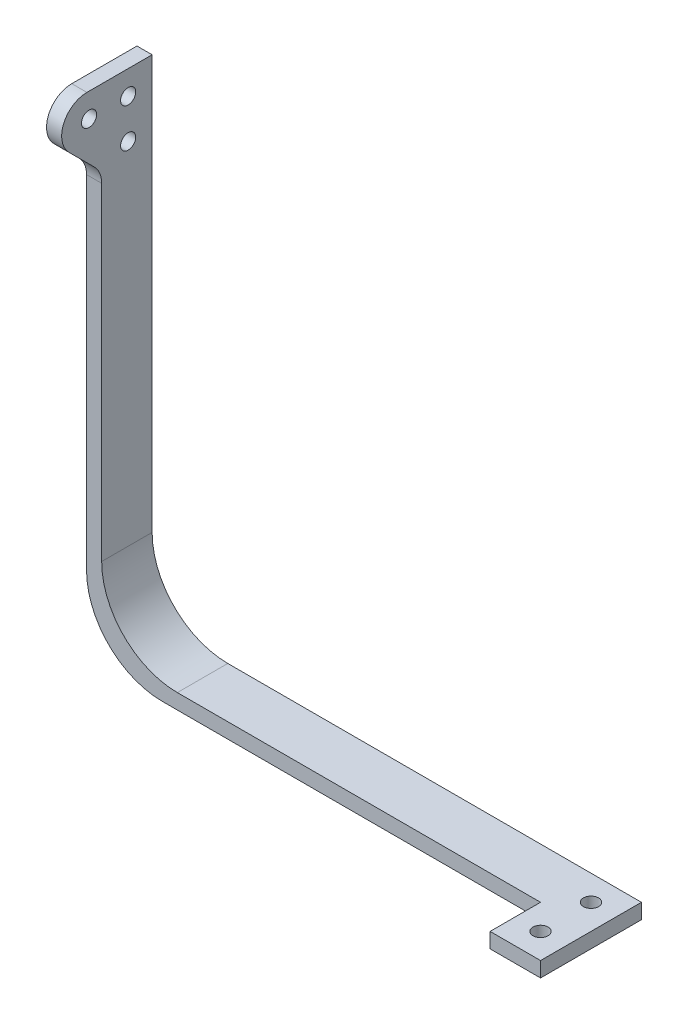
ISO-10303-21;
HEADER;
FILE_DESCRIPTION(('STEP AP214'),'2;1');
FILE_NAME('part.step','',(''),(''),'','','');
FILE_SCHEMA(('AUTOMOTIVE_DESIGN { 1 0 10303 214 1 1 1 1 }'));
ENDSEC;
DATA;
#1=APPLICATION_CONTEXT('core data for automotive mechanical design processes');
#2=APPLICATION_PROTOCOL_DEFINITION('international standard','automotive_design',2000,#1);
#3=PRODUCT_CONTEXT('',#1,'mechanical');
#4=PRODUCT('Part','Part','',(#3));
#5=PRODUCT_RELATED_PRODUCT_CATEGORY('part','',(#4));
#6=PRODUCT_DEFINITION_FORMATION('','',#4);
#7=PRODUCT_DEFINITION_CONTEXT('part definition',#1,'design');
#8=PRODUCT_DEFINITION('design','',#6,#7);
#9=PRODUCT_DEFINITION_SHAPE('','',#8);
#10=(LENGTH_UNIT() NAMED_UNIT(*) SI_UNIT(.MILLI.,.METRE.));
#11=(NAMED_UNIT(*) PLANE_ANGLE_UNIT() SI_UNIT($,.RADIAN.));
#12=(NAMED_UNIT(*) SI_UNIT($,.STERADIAN.) SOLID_ANGLE_UNIT());
#13=UNCERTAINTY_MEASURE_WITH_UNIT(LENGTH_MEASURE(1.E-05),#10,'distance_accuracy_value','');
#14=(GEOMETRIC_REPRESENTATION_CONTEXT(3) GLOBAL_UNCERTAINTY_ASSIGNED_CONTEXT((#13)) GLOBAL_UNIT_ASSIGNED_CONTEXT((#10,
#11,#12)) REPRESENTATION_CONTEXT('',''));
#15=CARTESIAN_POINT('',(0.,0.,0.));
#16=DIRECTION('',(0.,0.,1.));
#17=DIRECTION('',(1.,0.,0.));
#18=AXIS2_PLACEMENT_3D('',#15,#16,#17);
#19=CARTESIAN_POINT('',(0.,0.,10.));
#20=DIRECTION('',(1.,0.,0.));
#21=DIRECTION('',(0.,0.,-1.));
#22=AXIS2_PLACEMENT_3D('',#19,#20,#21);
#23=PLANE('',#22);
#24=DIRECTION('',(0.,-0.707106781186547,-0.707106781186548));
#25=VECTOR('',#24,1.);
#26=CARTESIAN_POINT('',(0.,75.,0.));
#27=LINE('',#26,#25);
#28=CARTESIAN_POINT('',(0.,91.4644660940673,16.4644660940673));
#29=VERTEX_POINT('',#28);
#30=CARTESIAN_POINT('',(0.,86.4644660940673,11.4644660940673));
#31=VERTEX_POINT('',#30);
#32=EDGE_CURVE('E149',#29,#31,#27,.T.);
#33=ORIENTED_EDGE('',*,*,#32,.F.);
#34=CARTESIAN_POINT('',(0.,95.,12.9289321881345));
#35=DIRECTION('',(1.,0.,0.));
#36=DIRECTION('',(0.,0.,-1.));
#37=AXIS2_PLACEMENT_3D('',#34,#35,#36);
#38=CIRCLE('',#37,5.);
#39=CARTESIAN_POINT('',(0.,100.,12.9289321881345));
#40=VERTEX_POINT('',#39);
#41=EDGE_CURVE('E48',#29,#40,#38,.F.);
#42=ORIENTED_EDGE('',*,*,#41,.T.);
#43=DIRECTION('',(0.,0.,1.));
#44=VECTOR('',#43,1.);
#45=CARTESIAN_POINT('',(0.,100.,0.));
#46=LINE('',#45,#44);
#47=CARTESIAN_POINT('',(0.,100.,0.));
#48=VERTEX_POINT('',#47);
#49=EDGE_CURVE('E145',#48,#40,#46,.T.);
#50=ORIENTED_EDGE('',*,*,#49,.F.);
#51=DIRECTION('',(0.,-1.,0.));
#52=VECTOR('',#51,1.);
#53=CARTESIAN_POINT('',(0.,0.,0.));
#54=LINE('',#53,#52);
#55=CARTESIAN_POINT('',(0.,15.,0.));
#56=VERTEX_POINT('',#55);
#57=EDGE_CURVE('E130',#48,#56,#54,.T.);
#58=ORIENTED_EDGE('',*,*,#57,.T.);
#59=DIRECTION('',(0.,0.,-1.));
#60=VECTOR('',#59,1.);
#61=CARTESIAN_POINT('',(0.,15.,10.));
#62=LINE('',#61,#60);
#63=CARTESIAN_POINT('',(0.,15.,10.));
#64=VERTEX_POINT('',#63);
#65=EDGE_CURVE('E220',#56,#64,#62,.F.);
#66=ORIENTED_EDGE('',*,*,#65,.T.);
#67=DIRECTION('',(0.,-1.,0.));
#68=VECTOR('',#67,1.);
#69=CARTESIAN_POINT('',(0.,0.,10.));
#70=LINE('',#69,#68);
#71=CARTESIAN_POINT('',(0.,82.9289321881345,10.));
#72=VERTEX_POINT('',#71);
#73=EDGE_CURVE('E193',#72,#64,#70,.T.);
#74=ORIENTED_EDGE('',*,*,#73,.F.);
#75=CARTESIAN_POINT('',(0.,82.9289321881345,15.));
#76=DIRECTION('',(1.,0.,0.));
#77=DIRECTION('',(0.,0.,-1.));
#78=AXIS2_PLACEMENT_3D('',#75,#76,#77);
#79=CIRCLE('',#78,5.);
#80=EDGE_CURVE('E41',#72,#31,#79,.T.);
#81=ORIENTED_EDGE('',*,*,#80,.T.);
#82=EDGE_LOOP('',(#33,#42,#50,#58,#66,#74,#81));
#83=FACE_BOUND('',#82,.T.);
#84=CARTESIAN_POINT('',(0.,87.5,4.75));
#85=DIRECTION('',(1.,0.,0.));
#86=DIRECTION('',(0.,1.,0.));
#87=AXIS2_PLACEMENT_3D('',#84,#85,#86);
#88=CIRCLE('',#87,1.5);
#89=CARTESIAN_POINT('',(0.,89.,4.75));
#90=VERTEX_POINT('',#89);
#91=EDGE_CURVE('E498',#90,#90,#88,.T.);
#92=ORIENTED_EDGE('',*,*,#91,.T.);
#93=EDGE_LOOP('',(#92));
#94=FACE_BOUND('',#93,.T.);
#95=CARTESIAN_POINT('',(0.,95.25,4.75));
#96=DIRECTION('',(1.,0.,0.));
#97=DIRECTION('',(0.,1.,0.));
#98=AXIS2_PLACEMENT_3D('',#95,#96,#97);
#99=CIRCLE('',#98,1.5);
#100=CARTESIAN_POINT('',(0.,96.75,4.75));
#101=VERTEX_POINT('',#100);
#102=EDGE_CURVE('E491',#101,#101,#99,.T.);
#103=ORIENTED_EDGE('',*,*,#102,.T.);
#104=EDGE_LOOP('',(#103));
#105=FACE_BOUND('',#104,.T.);
#106=CARTESIAN_POINT('',(0.,95.25,12.5));
#107=DIRECTION('',(1.,0.,0.));
#108=DIRECTION('',(0.,1.,0.));
#109=AXIS2_PLACEMENT_3D('',#106,#107,#108);
#110=CIRCLE('',#109,1.5);
#111=CARTESIAN_POINT('',(0.,96.75,12.5));
#112=VERTEX_POINT('',#111);
#113=EDGE_CURVE('E162',#112,#112,#110,.T.);
#114=ORIENTED_EDGE('',*,*,#113,.T.);
#115=EDGE_LOOP('',(#114));
#116=FACE_BOUND('',#115,.T.);
#117=ADVANCED_FACE('F33',(#83,#94,#105,#116),#23,.F.);
#118=CARTESIAN_POINT('',(0.,0.,10.));
#119=DIRECTION('',(0.,1.,0.));
#120=DIRECTION('',(0.,0.,1.));
#121=AXIS2_PLACEMENT_3D('',#118,#119,#120);
#122=PLANE('',#121);
#123=CARTESIAN_POINT('',(95.,0.,15.));
#124=DIRECTION('',(0.,1.,0.));
#125=DIRECTION('',(0.,0.,-1.));
#126=AXIS2_PLACEMENT_3D('',#123,#124,#125);
#127=CIRCLE('',#126,1.5);
#128=CARTESIAN_POINT('',(95.,0.,13.5));
#129=VERTEX_POINT('',#128);
#130=EDGE_CURVE('E164',#129,#129,#127,.T.);
#131=ORIENTED_EDGE('',*,*,#130,.T.);
#132=EDGE_LOOP('',(#131));
#133=FACE_BOUND('',#132,.T.);
#134=CARTESIAN_POINT('',(95.,0.,5.));
#135=DIRECTION('',(0.,1.,0.));
#136=DIRECTION('',(0.,0.,1.));
#137=AXIS2_PLACEMENT_3D('',#134,#135,#136);
#138=CIRCLE('',#137,1.5);
#139=CARTESIAN_POINT('',(95.,0.,6.5));
#140=VERTEX_POINT('',#139);
#141=EDGE_CURVE('E170',#140,#140,#138,.T.);
#142=ORIENTED_EDGE('',*,*,#141,.T.);
#143=EDGE_LOOP('',(#142));
#144=FACE_BOUND('',#143,.T.);
#145=DIRECTION('',(1.,0.,0.));
#146=VECTOR('',#145,1.);
#147=CARTESIAN_POINT('',(0.,0.,10.));
#148=LINE('',#147,#146);
#149=CARTESIAN_POINT('',(15.,0.,10.));
#150=VERTEX_POINT('',#149);
#151=CARTESIAN_POINT('',(90.,0.,10.));
#152=VERTEX_POINT('',#151);
#153=EDGE_CURVE('E195',#150,#152,#148,.T.);
#154=ORIENTED_EDGE('',*,*,#153,.F.);
#155=DIRECTION('',(0.,0.,-1.));
#156=VECTOR('',#155,1.);
#157=CARTESIAN_POINT('',(15.,0.,10.));
#158=LINE('',#157,#156);
#159=CARTESIAN_POINT('',(15.,0.,0.));
#160=VERTEX_POINT('',#159);
#161=EDGE_CURVE('E217',#150,#160,#158,.T.);
#162=ORIENTED_EDGE('',*,*,#161,.T.);
#163=DIRECTION('',(1.,0.,0.));
#164=VECTOR('',#163,1.);
#165=CARTESIAN_POINT('',(0.,0.,0.));
#166=LINE('',#165,#164);
#167=CARTESIAN_POINT('',(100.,0.,0.));
#168=VERTEX_POINT('',#167);
#169=EDGE_CURVE('E140',#160,#168,#166,.T.);
#170=ORIENTED_EDGE('',*,*,#169,.T.);
#171=DIRECTION('',(0.,0.,-1.));
#172=VECTOR('',#171,1.);
#173=CARTESIAN_POINT('',(100.,0.,10.));
#174=LINE('',#173,#172);
#175=CARTESIAN_POINT('',(100.,0.,20.));
#176=VERTEX_POINT('',#175);
#177=EDGE_CURVE('E214',#176,#168,#174,.T.);
#178=ORIENTED_EDGE('',*,*,#177,.F.);
#179=DIRECTION('',(1.,0.,0.));
#180=VECTOR('',#179,1.);
#181=CARTESIAN_POINT('',(100.,0.,20.));
#182=LINE('',#181,#180);
#183=CARTESIAN_POINT('',(90.,0.,20.));
#184=VERTEX_POINT('',#183);
#185=EDGE_CURVE('E183',#184,#176,#182,.T.);
#186=ORIENTED_EDGE('',*,*,#185,.F.);
#187=DIRECTION('',(0.,0.,-1.));
#188=VECTOR('',#187,1.);
#189=CARTESIAN_POINT('',(90.,0.,20.));
#190=LINE('',#189,#188);
#191=EDGE_CURVE('E186',#184,#152,#190,.T.);
#192=ORIENTED_EDGE('',*,*,#191,.T.);
#193=EDGE_LOOP('',(#154,#162,#170,#178,#186,#192));
#194=FACE_BOUND('',#193,.T.);
#195=ADVANCED_FACE('F276',(#133,#144,#194),#122,.F.);
#196=CARTESIAN_POINT('',(100.,3.,10.));
#197=DIRECTION('',(-1.,0.,0.));
#198=DIRECTION('',(0.,0.,1.));
#199=AXIS2_PLACEMENT_3D('',#196,#197,#198);
#200=PLANE('',#199);
#201=DIRECTION('',(0.,1.,0.));
#202=VECTOR('',#201,1.);
#203=CARTESIAN_POINT('',(100.,3.,0.));
#204=LINE('',#203,#202);
#205=CARTESIAN_POINT('',(100.,3.,0.));
#206=VERTEX_POINT('',#205);
#207=EDGE_CURVE('E206',#168,#206,#204,.T.);
#208=ORIENTED_EDGE('',*,*,#207,.T.);
#209=DIRECTION('',(0.,0.,-1.));
#210=VECTOR('',#209,1.);
#211=CARTESIAN_POINT('',(100.,3.,10.));
#212=LINE('',#211,#210);
#213=CARTESIAN_POINT('',(100.,3.,20.));
#214=VERTEX_POINT('',#213);
#215=EDGE_CURVE('E203',#214,#206,#212,.T.);
#216=ORIENTED_EDGE('',*,*,#215,.F.);
#217=DIRECTION('',(0.,1.,0.));
#218=VECTOR('',#217,1.);
#219=CARTESIAN_POINT('',(100.,3.,20.));
#220=LINE('',#219,#218);
#221=EDGE_CURVE('E176',#176,#214,#220,.T.);
#222=ORIENTED_EDGE('',*,*,#221,.F.);
#223=ORIENTED_EDGE('',*,*,#177,.T.);
#224=EDGE_LOOP('',(#208,#216,#222,#223));
#225=FACE_BOUND('',#224,.T.);
#226=ADVANCED_FACE('F273',(#225),#200,.F.);
#227=CARTESIAN_POINT('',(3.00000000000001,3.,10.));
#228=DIRECTION('',(0.,-1.,0.));
#229=DIRECTION('',(0.,0.,-1.));
#230=AXIS2_PLACEMENT_3D('',#227,#228,#229);
#231=PLANE('',#230);
#232=CARTESIAN_POINT('',(95.,3.,15.));
#233=DIRECTION('',(0.,1.,0.));
#234=DIRECTION('',(0.,0.,-1.));
#235=AXIS2_PLACEMENT_3D('',#232,#233,#234);
#236=CIRCLE('',#235,1.5);
#237=CARTESIAN_POINT('',(95.,3.,13.5));
#238=VERTEX_POINT('',#237);
#239=EDGE_CURVE('E148',#238,#238,#236,.T.);
#240=ORIENTED_EDGE('',*,*,#239,.F.);
#241=EDGE_LOOP('',(#240));
#242=FACE_BOUND('',#241,.T.);
#243=CARTESIAN_POINT('',(95.,3.,5.));
#244=DIRECTION('',(0.,1.,0.));
#245=DIRECTION('',(0.,0.,1.));
#246=AXIS2_PLACEMENT_3D('',#243,#244,#245);
#247=CIRCLE('',#246,1.5);
#248=CARTESIAN_POINT('',(95.,3.,6.5));
#249=VERTEX_POINT('',#248);
#250=EDGE_CURVE('E167',#249,#249,#247,.T.);
#251=ORIENTED_EDGE('',*,*,#250,.F.);
#252=EDGE_LOOP('',(#251));
#253=FACE_BOUND('',#252,.T.);
#254=DIRECTION('',(-1.,0.,0.));
#255=VECTOR('',#254,1.);
#256=CARTESIAN_POINT('',(3.00000000000001,3.,0.));
#257=LINE('',#256,#255);
#258=CARTESIAN_POINT('',(18.,3.,0.));
#259=VERTEX_POINT('',#258);
#260=EDGE_CURVE('E208',#206,#259,#257,.T.);
#261=ORIENTED_EDGE('',*,*,#260,.T.);
#262=DIRECTION('',(0.,0.,-1.));
#263=VECTOR('',#262,1.);
#264=CARTESIAN_POINT('',(18.,3.,10.));
#265=LINE('',#264,#263);
#266=CARTESIAN_POINT('',(18.,3.,10.));
#267=VERTEX_POINT('',#266);
#268=EDGE_CURVE('E225',#259,#267,#265,.F.);
#269=ORIENTED_EDGE('',*,*,#268,.T.);
#270=DIRECTION('',(-1.,0.,0.));
#271=VECTOR('',#270,1.);
#272=CARTESIAN_POINT('',(3.00000000000001,3.,10.));
#273=LINE('',#272,#271);
#274=CARTESIAN_POINT('',(90.,3.,10.));
#275=VERTEX_POINT('',#274);
#276=EDGE_CURVE('E198',#275,#267,#273,.T.);
#277=ORIENTED_EDGE('',*,*,#276,.F.);
#278=DIRECTION('',(0.,0.,-1.));
#279=VECTOR('',#278,1.);
#280=CARTESIAN_POINT('',(90.,3.,20.));
#281=LINE('',#280,#279);
#282=CARTESIAN_POINT('',(90.,3.,20.));
#283=VERTEX_POINT('',#282);
#284=EDGE_CURVE('E141',#283,#275,#281,.T.);
#285=ORIENTED_EDGE('',*,*,#284,.F.);
#286=DIRECTION('',(-1.,0.,0.));
#287=VECTOR('',#286,1.);
#288=CARTESIAN_POINT('',(100.,3.,20.));
#289=LINE('',#288,#287);
#290=EDGE_CURVE('E179',#214,#283,#289,.T.);
#291=ORIENTED_EDGE('',*,*,#290,.F.);
#292=ORIENTED_EDGE('',*,*,#215,.T.);
#293=EDGE_LOOP('',(#261,#269,#277,#285,#291,#292));
#294=FACE_BOUND('',#293,.T.);
#295=ADVANCED_FACE('F268',(#242,#253,#294),#231,.F.);
#296=CARTESIAN_POINT('',(3.,85.,10.));
#297=DIRECTION('',(-1.,0.,0.));
#298=DIRECTION('',(0.,-1.,0.));
#299=AXIS2_PLACEMENT_3D('',#296,#297,#298);
#300=PLANE('',#299);
#301=DIRECTION('',(0.,0.,1.));
#302=VECTOR('',#301,1.);
#303=CARTESIAN_POINT('',(3.,100.,0.));
#304=LINE('',#303,#302);
#305=CARTESIAN_POINT('',(3.,100.,0.));
#306=VERTEX_POINT('',#305);
#307=CARTESIAN_POINT('',(3.,100.,12.9289321881345));
#308=VERTEX_POINT('',#307);
#309=EDGE_CURVE('E147',#306,#308,#304,.T.);
#310=ORIENTED_EDGE('',*,*,#309,.T.);
#311=CARTESIAN_POINT('',(3.,95.,12.9289321881345));
#312=DIRECTION('',(-1.,0.,0.));
#313=DIRECTION('',(0.,-1.,0.));
#314=AXIS2_PLACEMENT_3D('',#311,#312,#313);
#315=CIRCLE('',#314,5.);
#316=CARTESIAN_POINT('',(3.,91.4644660940673,16.4644660940673));
#317=VERTEX_POINT('',#316);
#318=EDGE_CURVE('E56',#308,#317,#315,.F.);
#319=ORIENTED_EDGE('',*,*,#318,.T.);
#320=DIRECTION('',(0.,-0.707106781186547,-0.707106781186548));
#321=VECTOR('',#320,1.);
#322=CARTESIAN_POINT('',(3.,75.,0.));
#323=LINE('',#322,#321);
#324=CARTESIAN_POINT('',(3.,86.4644660940673,11.4644660940673));
#325=VERTEX_POINT('',#324);
#326=EDGE_CURVE('E152',#317,#325,#323,.T.);
#327=ORIENTED_EDGE('',*,*,#326,.T.);
#328=CARTESIAN_POINT('',(3.,82.9289321881345,15.));
#329=DIRECTION('',(-1.,0.,0.));
#330=DIRECTION('',(0.,-1.,0.));
#331=AXIS2_PLACEMENT_3D('',#328,#329,#330);
#332=CIRCLE('',#331,5.);
#333=CARTESIAN_POINT('',(3.,82.9289321881345,10.));
#334=VERTEX_POINT('',#333);
#335=EDGE_CURVE('E11',#325,#334,#332,.T.);
#336=ORIENTED_EDGE('',*,*,#335,.T.);
#337=DIRECTION('',(0.,1.,0.));
#338=VECTOR('',#337,1.);
#339=CARTESIAN_POINT('',(3.,85.,10.));
#340=LINE('',#339,#338);
#341=CARTESIAN_POINT('',(3.00000000000001,18.,10.));
#342=VERTEX_POINT('',#341);
#343=EDGE_CURVE('E201',#342,#334,#340,.T.);
#344=ORIENTED_EDGE('',*,*,#343,.F.);
#345=DIRECTION('',(0.,0.,-1.));
#346=VECTOR('',#345,1.);
#347=CARTESIAN_POINT('',(3.00000000000001,18.,0.));
#348=LINE('',#347,#346);
#349=CARTESIAN_POINT('',(3.00000000000001,18.,0.));
#350=VERTEX_POINT('',#349);
#351=EDGE_CURVE('E222',#342,#350,#348,.T.);
#352=ORIENTED_EDGE('',*,*,#351,.T.);
#353=DIRECTION('',(0.,1.,0.));
#354=VECTOR('',#353,1.);
#355=CARTESIAN_POINT('',(3.,85.,0.));
#356=LINE('',#355,#354);
#357=EDGE_CURVE('E196',#350,#306,#356,.T.);
#358=ORIENTED_EDGE('',*,*,#357,.T.);
#359=EDGE_LOOP('',(#310,#319,#327,#336,#344,#352,#358));
#360=FACE_BOUND('',#359,.T.);
#361=CARTESIAN_POINT('',(3.,95.25,12.5));
#362=DIRECTION('',(1.,0.,0.));
#363=DIRECTION('',(0.,1.,0.));
#364=AXIS2_PLACEMENT_3D('',#361,#362,#363);
#365=CIRCLE('',#364,1.5);
#366=CARTESIAN_POINT('',(3.,96.75,12.5));
#367=VERTEX_POINT('',#366);
#368=EDGE_CURVE('E159',#367,#367,#365,.T.);
#369=ORIENTED_EDGE('',*,*,#368,.F.);
#370=EDGE_LOOP('',(#369));
#371=FACE_BOUND('',#370,.T.);
#372=CARTESIAN_POINT('',(3.,95.25,4.75));
#373=DIRECTION('',(1.,0.,0.));
#374=DIRECTION('',(0.,1.,0.));
#375=AXIS2_PLACEMENT_3D('',#372,#373,#374);
#376=CIRCLE('',#375,1.5);
#377=CARTESIAN_POINT('',(3.,96.75,4.75));
#378=VERTEX_POINT('',#377);
#379=EDGE_CURVE('E493',#378,#378,#376,.T.);
#380=ORIENTED_EDGE('',*,*,#379,.F.);
#381=EDGE_LOOP('',(#380));
#382=FACE_BOUND('',#381,.T.);
#383=CARTESIAN_POINT('',(3.,87.5,4.75));
#384=DIRECTION('',(1.,0.,0.));
#385=DIRECTION('',(0.,1.,0.));
#386=AXIS2_PLACEMENT_3D('',#383,#384,#385);
#387=CIRCLE('',#386,1.5);
#388=CARTESIAN_POINT('',(3.,89.,4.75));
#389=VERTEX_POINT('',#388);
#390=EDGE_CURVE('E501',#389,#389,#387,.T.);
#391=ORIENTED_EDGE('',*,*,#390,.F.);
#392=EDGE_LOOP('',(#391));
#393=FACE_BOUND('',#392,.T.);
#394=ADVANCED_FACE('F255',(#360,#371,#382,#393),#300,.F.);
#395=CARTESIAN_POINT('',(0.,0.,10.));
#396=DIRECTION('',(0.,0.,1.));
#397=DIRECTION('',(1.,0.,0.));
#398=AXIS2_PLACEMENT_3D('',#395,#396,#397);
#399=PLANE('',#398);
#400=ORIENTED_EDGE('',*,*,#343,.T.);
#401=DIRECTION('',(-1.,0.,0.));
#402=VECTOR('',#401,1.);
#403=CARTESIAN_POINT('',(0.,82.9289321881345,10.));
#404=LINE('',#403,#402);
#405=EDGE_CURVE('E234',#334,#72,#404,.T.);
#406=ORIENTED_EDGE('',*,*,#405,.T.);
#407=ORIENTED_EDGE('',*,*,#73,.T.);
#408=CARTESIAN_POINT('',(15.,15.,10.));
#409=DIRECTION('',(0.,0.,1.));
#410=DIRECTION('',(1.,0.,0.));
#411=AXIS2_PLACEMENT_3D('',#408,#409,#410);
#412=CIRCLE('',#411,15.);
#413=EDGE_CURVE('E232',#64,#150,#412,.T.);
#414=ORIENTED_EDGE('',*,*,#413,.T.);
#415=ORIENTED_EDGE('',*,*,#153,.T.);
#416=DIRECTION('',(0.,-1.,0.));
#417=VECTOR('',#416,1.);
#418=CARTESIAN_POINT('',(90.,3.,10.));
#419=LINE('',#418,#417);
#420=EDGE_CURVE('E173',#275,#152,#419,.T.);
#421=ORIENTED_EDGE('',*,*,#420,.F.);
#422=ORIENTED_EDGE('',*,*,#276,.T.);
#423=CARTESIAN_POINT('',(18.,18.,10.));
#424=DIRECTION('',(0.,0.,1.));
#425=DIRECTION('',(1.,0.,0.));
#426=AXIS2_PLACEMENT_3D('',#423,#424,#425);
#427=CIRCLE('',#426,15.);
#428=EDGE_CURVE('E229',#267,#342,#427,.F.);
#429=ORIENTED_EDGE('',*,*,#428,.T.);
#430=EDGE_LOOP('',(#400,#406,#407,#414,#415,#421,#422,#429));
#431=FACE_BOUND('',#430,.T.);
#432=ADVANCED_FACE('F259',(#431),#399,.T.);
#433=CARTESIAN_POINT('',(0.,0.,0.));
#434=DIRECTION('',(0.,0.,1.));
#435=DIRECTION('',(1.,0.,0.));
#436=AXIS2_PLACEMENT_3D('',#433,#434,#435);
#437=PLANE('',#436);
#438=CARTESIAN_POINT('',(15.,15.,0.));
#439=DIRECTION('',(0.,0.,1.));
#440=DIRECTION('',(1.,0.,0.));
#441=AXIS2_PLACEMENT_3D('',#438,#439,#440);
#442=CIRCLE('',#441,15.);
#443=EDGE_CURVE('E137',#160,#56,#442,.F.);
#444=ORIENTED_EDGE('',*,*,#443,.T.);
#445=ORIENTED_EDGE('',*,*,#57,.F.);
#446=DIRECTION('',(1.,0.,0.));
#447=VECTOR('',#446,1.);
#448=CARTESIAN_POINT('',(0.,100.,0.));
#449=LINE('',#448,#447);
#450=EDGE_CURVE('E134',#48,#306,#449,.T.);
#451=ORIENTED_EDGE('',*,*,#450,.T.);
#452=ORIENTED_EDGE('',*,*,#357,.F.);
#453=CARTESIAN_POINT('',(18.,18.,0.));
#454=DIRECTION('',(0.,0.,1.));
#455=DIRECTION('',(1.,0.,0.));
#456=AXIS2_PLACEMENT_3D('',#453,#454,#455);
#457=CIRCLE('',#456,15.);
#458=EDGE_CURVE('E227',#350,#259,#457,.T.);
#459=ORIENTED_EDGE('',*,*,#458,.T.);
#460=ORIENTED_EDGE('',*,*,#260,.F.);
#461=ORIENTED_EDGE('',*,*,#207,.F.);
#462=ORIENTED_EDGE('',*,*,#169,.F.);
#463=EDGE_LOOP('',(#444,#445,#451,#452,#459,#460,#461,#462));
#464=FACE_BOUND('',#463,.T.);
#465=ADVANCED_FACE('F132',(#464),#437,.F.);
#466=CARTESIAN_POINT('',(90.,3.,20.));
#467=DIRECTION('',(1.,0.,0.));
#468=DIRECTION('',(0.,0.,-1.));
#469=AXIS2_PLACEMENT_3D('',#466,#467,#468);
#470=PLANE('',#469);
#471=ORIENTED_EDGE('',*,*,#420,.T.);
#472=ORIENTED_EDGE('',*,*,#191,.F.);
#473=DIRECTION('',(0.,-1.,0.));
#474=VECTOR('',#473,1.);
#475=CARTESIAN_POINT('',(90.,3.,20.));
#476=LINE('',#475,#474);
#477=EDGE_CURVE('E181',#283,#184,#476,.T.);
#478=ORIENTED_EDGE('',*,*,#477,.F.);
#479=ORIENTED_EDGE('',*,*,#284,.T.);
#480=EDGE_LOOP('',(#471,#472,#478,#479));
#481=FACE_BOUND('',#480,.T.);
#482=ADVANCED_FACE('F284',(#481),#470,.F.);
#483=CARTESIAN_POINT('',(0.,0.,20.));
#484=DIRECTION('',(0.,0.,-1.));
#485=DIRECTION('',(-1.,0.,0.));
#486=AXIS2_PLACEMENT_3D('',#483,#484,#485);
#487=PLANE('',#486);
#488=ORIENTED_EDGE('',*,*,#221,.T.);
#489=ORIENTED_EDGE('',*,*,#290,.T.);
#490=ORIENTED_EDGE('',*,*,#477,.T.);
#491=ORIENTED_EDGE('',*,*,#185,.T.);
#492=EDGE_LOOP('',(#488,#489,#490,#491));
#493=FACE_BOUND('',#492,.T.);
#494=ADVANCED_FACE('F287',(#493),#487,.F.);
#495=CARTESIAN_POINT('',(95.,0.,5.));
#496=DIRECTION('',(0.,1.,0.));
#497=DIRECTION('',(0.,0.,1.));
#498=AXIS2_PLACEMENT_3D('',#495,#496,#497);
#499=CYLINDRICAL_SURFACE('',#498,1.5);
#500=ORIENTED_EDGE('',*,*,#141,.F.);
#501=EDGE_LOOP('',(#500));
#502=FACE_BOUND('',#501,.T.);
#503=ORIENTED_EDGE('',*,*,#250,.T.);
#504=EDGE_LOOP('',(#503));
#505=FACE_BOUND('',#504,.T.);
#506=ADVANCED_FACE('F289',(#502,#505),#499,.F.);
#507=CARTESIAN_POINT('',(95.,0.,15.));
#508=DIRECTION('',(0.,1.,0.));
#509=DIRECTION('',(0.,0.,1.));
#510=AXIS2_PLACEMENT_3D('',#507,#508,#509);
#511=CYLINDRICAL_SURFACE('',#510,1.5);
#512=ORIENTED_EDGE('',*,*,#130,.F.);
#513=EDGE_LOOP('',(#512));
#514=FACE_BOUND('',#513,.T.);
#515=ORIENTED_EDGE('',*,*,#239,.T.);
#516=EDGE_LOOP('',(#515));
#517=FACE_BOUND('',#516,.T.);
#518=ADVANCED_FACE('F295',(#514,#517),#511,.F.);
#519=CARTESIAN_POINT('',(15.,15.,10.));
#520=DIRECTION('',(0.,0.,-1.));
#521=DIRECTION('',(-1.,0.,0.));
#522=AXIS2_PLACEMENT_3D('',#519,#520,#521);
#523=CYLINDRICAL_SURFACE('',#522,15.);
#524=ORIENTED_EDGE('',*,*,#413,.F.);
#525=ORIENTED_EDGE('',*,*,#65,.F.);
#526=ORIENTED_EDGE('',*,*,#443,.F.);
#527=ORIENTED_EDGE('',*,*,#161,.F.);
#528=EDGE_LOOP('',(#524,#525,#526,#527));
#529=FACE_BOUND('',#528,.T.);
#530=ADVANCED_FACE('F281',(#529),#523,.T.);
#531=CARTESIAN_POINT('',(18.,18.,10.));
#532=DIRECTION('',(0.,0.,1.));
#533=DIRECTION('',(1.,0.,0.));
#534=AXIS2_PLACEMENT_3D('',#531,#532,#533);
#535=CYLINDRICAL_SURFACE('',#534,15.);
#536=ORIENTED_EDGE('',*,*,#428,.F.);
#537=ORIENTED_EDGE('',*,*,#268,.F.);
#538=ORIENTED_EDGE('',*,*,#458,.F.);
#539=ORIENTED_EDGE('',*,*,#351,.F.);
#540=EDGE_LOOP('',(#536,#537,#538,#539));
#541=FACE_BOUND('',#540,.T.);
#542=ADVANCED_FACE('F264',(#541),#535,.F.);
#543=CARTESIAN_POINT('',(0.,75.,0.));
#544=DIRECTION('',(0.,-0.707106781186548,0.707106781186547));
#545=DIRECTION('',(0.,-0.707106781186547,-0.707106781186548));
#546=AXIS2_PLACEMENT_3D('',#543,#544,#545);
#547=PLANE('',#546);
#548=ORIENTED_EDGE('',*,*,#32,.T.);
#549=DIRECTION('',(-1.,0.,0.));
#550=VECTOR('',#549,1.);
#551=CARTESIAN_POINT('',(3.,86.4644660940673,11.4644660940673));
#552=LINE('',#551,#550);
#553=EDGE_CURVE('E239',#31,#325,#552,.F.);
#554=ORIENTED_EDGE('',*,*,#553,.T.);
#555=ORIENTED_EDGE('',*,*,#326,.F.);
#556=DIRECTION('',(1.,0.,0.));
#557=VECTOR('',#556,1.);
#558=CARTESIAN_POINT('',(0.,91.4644660940673,16.4644660940673));
#559=LINE('',#558,#557);
#560=EDGE_CURVE('E237',#317,#29,#559,.F.);
#561=ORIENTED_EDGE('',*,*,#560,.T.);
#562=EDGE_LOOP('',(#548,#554,#555,#561));
#563=FACE_BOUND('',#562,.T.);
#564=ADVANCED_FACE('F249',(#563),#547,.T.);
#565=CARTESIAN_POINT('',(0.,100.,0.));
#566=DIRECTION('',(0.,1.,0.));
#567=DIRECTION('',(-1.,0.,0.));
#568=AXIS2_PLACEMENT_3D('',#565,#566,#567);
#569=PLANE('',#568);
#570=ORIENTED_EDGE('',*,*,#49,.T.);
#571=DIRECTION('',(1.,0.,0.));
#572=VECTOR('',#571,1.);
#573=CARTESIAN_POINT('',(0.,100.,12.9289321881345));
#574=LINE('',#573,#572);
#575=EDGE_CURVE('E241',#40,#308,#574,.T.);
#576=ORIENTED_EDGE('',*,*,#575,.T.);
#577=ORIENTED_EDGE('',*,*,#309,.F.);
#578=ORIENTED_EDGE('',*,*,#450,.F.);
#579=EDGE_LOOP('',(#570,#576,#577,#578));
#580=FACE_BOUND('',#579,.T.);
#581=ADVANCED_FACE('F144',(#580),#569,.T.);
#582=CARTESIAN_POINT('',(0.,95.25,12.5));
#583=DIRECTION('',(1.,0.,0.));
#584=DIRECTION('',(0.,1.,0.));
#585=AXIS2_PLACEMENT_3D('',#582,#583,#584);
#586=CYLINDRICAL_SURFACE('',#585,1.5);
#587=ORIENTED_EDGE('',*,*,#113,.F.);
#588=EDGE_LOOP('',(#587));
#589=FACE_BOUND('',#588,.T.);
#590=ORIENTED_EDGE('',*,*,#368,.T.);
#591=EDGE_LOOP('',(#590));
#592=FACE_BOUND('',#591,.T.);
#593=ADVANCED_FACE('F323',(#589,#592),#586,.F.);
#594=CARTESIAN_POINT('',(0.,95.25,4.75));
#595=DIRECTION('',(1.,0.,0.));
#596=DIRECTION('',(0.,1.,0.));
#597=AXIS2_PLACEMENT_3D('',#594,#595,#596);
#598=CYLINDRICAL_SURFACE('',#597,1.5);
#599=ORIENTED_EDGE('',*,*,#102,.F.);
#600=EDGE_LOOP('',(#599));
#601=FACE_BOUND('',#600,.T.);
#602=ORIENTED_EDGE('',*,*,#379,.T.);
#603=EDGE_LOOP('',(#602));
#604=FACE_BOUND('',#603,.T.);
#605=ADVANCED_FACE('F317',(#601,#604),#598,.F.);
#606=CARTESIAN_POINT('',(0.,87.5,4.75));
#607=DIRECTION('',(1.,0.,0.));
#608=DIRECTION('',(0.,1.,0.));
#609=AXIS2_PLACEMENT_3D('',#606,#607,#608);
#610=CYLINDRICAL_SURFACE('',#609,1.5);
#611=ORIENTED_EDGE('',*,*,#91,.F.);
#612=EDGE_LOOP('',(#611));
#613=FACE_BOUND('',#612,.T.);
#614=ORIENTED_EDGE('',*,*,#390,.T.);
#615=EDGE_LOOP('',(#614));
#616=FACE_BOUND('',#615,.T.);
#617=ADVANCED_FACE('F312',(#613,#616),#610,.F.);
#618=CARTESIAN_POINT('',(0.,82.9289321881345,15.));
#619=DIRECTION('',(1.,0.,0.));
#620=DIRECTION('',(0.,1.,0.));
#621=AXIS2_PLACEMENT_3D('',#618,#619,#620);
#622=CYLINDRICAL_SURFACE('',#621,5.);
#623=ORIENTED_EDGE('',*,*,#335,.F.);
#624=ORIENTED_EDGE('',*,*,#553,.F.);
#625=ORIENTED_EDGE('',*,*,#80,.F.);
#626=ORIENTED_EDGE('',*,*,#405,.F.);
#627=EDGE_LOOP('',(#623,#624,#625,#626));
#628=FACE_BOUND('',#627,.T.);
#629=ADVANCED_FACE('F252',(#628),#622,.F.);
#630=CARTESIAN_POINT('',(0.,95.,12.9289321881345));
#631=DIRECTION('',(1.,0.,0.));
#632=DIRECTION('',(0.,1.,0.));
#633=AXIS2_PLACEMENT_3D('',#630,#631,#632);
#634=CYLINDRICAL_SURFACE('',#633,5.);
#635=ORIENTED_EDGE('',*,*,#41,.F.);
#636=ORIENTED_EDGE('',*,*,#560,.F.);
#637=ORIENTED_EDGE('',*,*,#318,.F.);
#638=ORIENTED_EDGE('',*,*,#575,.F.);
#639=EDGE_LOOP('',(#635,#636,#637,#638));
#640=FACE_BOUND('',#639,.T.);
#641=ADVANCED_FACE('F35',(#640),#634,.T.);
#642=CLOSED_SHELL('',(#117,#195,#226,#295,#394,#432,#465,#482,#494,#506,#518,#530,#542,#564,
#581,#593,#605,#617,#629,#641));
#643=MANIFOLD_SOLID_BREP('B2',#642);
#644=ADVANCED_BREP_SHAPE_REPRESENTATION('',(#18,#643),#14);
#645=SHAPE_DEFINITION_REPRESENTATION(#9,#644);
ENDSEC;
END-ISO-10303-21;
